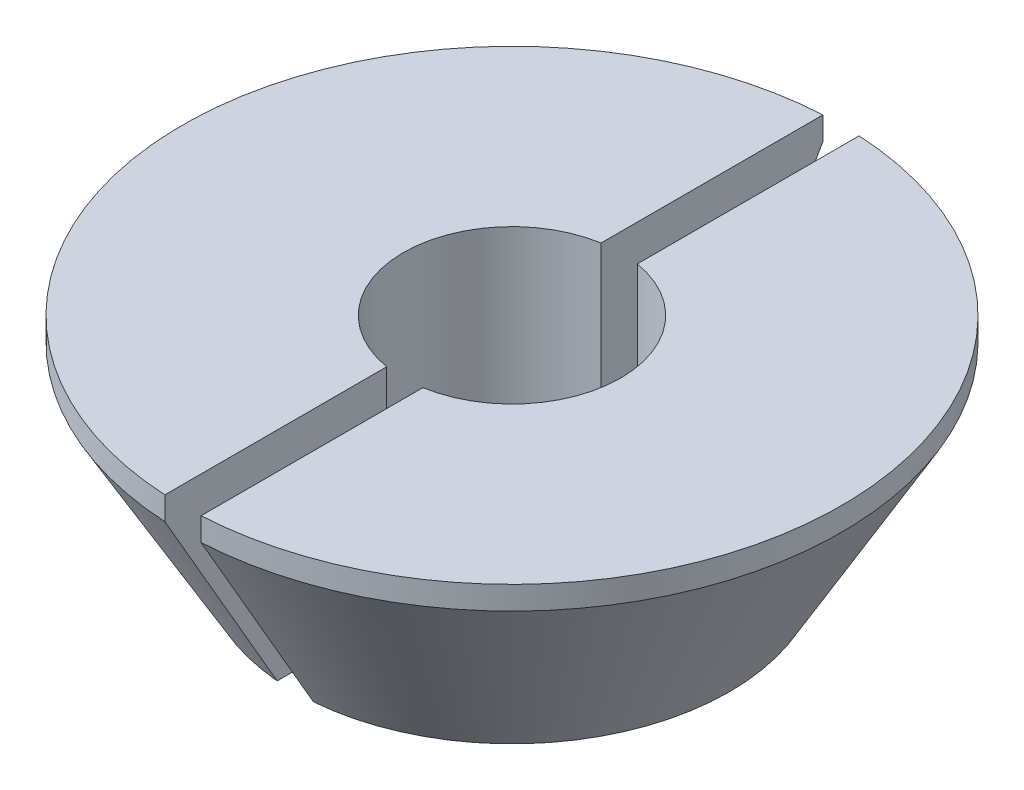
ISO-10303-21;
HEADER;
FILE_DESCRIPTION(('STEP AP214'),'2;1');
FILE_NAME('part.step','',(''),(''),'','','');
FILE_SCHEMA(('AUTOMOTIVE_DESIGN { 1 0 10303 214 1 1 1 1 }'));
ENDSEC;
DATA;
#1=APPLICATION_CONTEXT('core data for automotive mechanical design processes');
#2=APPLICATION_PROTOCOL_DEFINITION('international standard','automotive_design',2000,#1);
#3=PRODUCT_CONTEXT('',#1,'mechanical');
#4=PRODUCT('Part','Part','',(#3));
#5=PRODUCT_RELATED_PRODUCT_CATEGORY('part','',(#4));
#6=PRODUCT_DEFINITION_FORMATION('','',#4);
#7=PRODUCT_DEFINITION_CONTEXT('part definition',#1,'design');
#8=PRODUCT_DEFINITION('design','',#6,#7);
#9=PRODUCT_DEFINITION_SHAPE('','',#8);
#10=(LENGTH_UNIT() NAMED_UNIT(*) SI_UNIT(.MILLI.,.METRE.));
#11=(NAMED_UNIT(*) PLANE_ANGLE_UNIT() SI_UNIT($,.RADIAN.));
#12=(NAMED_UNIT(*) SI_UNIT($,.STERADIAN.) SOLID_ANGLE_UNIT());
#13=UNCERTAINTY_MEASURE_WITH_UNIT(LENGTH_MEASURE(1.E-05),#10,'distance_accuracy_value','');
#14=(GEOMETRIC_REPRESENTATION_CONTEXT(3) GLOBAL_UNCERTAINTY_ASSIGNED_CONTEXT((#13)) GLOBAL_UNIT_ASSIGNED_CONTEXT((#10,
#11,#12)) REPRESENTATION_CONTEXT('',''));
#15=CARTESIAN_POINT('',(0.,0.,0.));
#16=DIRECTION('',(0.,0.,1.));
#17=DIRECTION('',(1.,0.,0.));
#18=AXIS2_PLACEMENT_3D('',#15,#16,#17);
#19=CARTESIAN_POINT('',(0.,0.,0.));
#20=DIRECTION('',(0.,-1.,0.));
#21=DIRECTION('',(0.,0.,-1.));
#22=AXIS2_PLACEMENT_3D('',#19,#20,#21);
#23=CYLINDRICAL_SURFACE('',#22,1.5);
#24=DIRECTION('',(0.,-1.,0.));
#25=VECTOR('',#24,1.);
#26=CARTESIAN_POINT('',(0.25,0.,1.4790199457749));
#27=LINE('',#26,#25);
#28=CARTESIAN_POINT('',(0.25,3.,1.4790199457749));
#29=VERTEX_POINT('',#28);
#30=CARTESIAN_POINT('',(0.25,0.,1.4790199457749));
#31=VERTEX_POINT('',#30);
#32=EDGE_CURVE('E150',#29,#31,#27,.T.);
#33=ORIENTED_EDGE('',*,*,#32,.F.);
#34=CARTESIAN_POINT('',(0.,3.,0.));
#35=DIRECTION('',(0.,-1.,0.));
#36=DIRECTION('',(0.,0.,-1.));
#37=AXIS2_PLACEMENT_3D('',#34,#35,#36);
#38=CIRCLE('',#37,1.5);
#39=CARTESIAN_POINT('',(0.25,3.,-1.4790199457749));
#40=VERTEX_POINT('',#39);
#41=EDGE_CURVE('E52',#40,#29,#38,.T.);
#42=ORIENTED_EDGE('',*,*,#41,.F.);
#43=DIRECTION('',(0.,-1.,0.));
#44=VECTOR('',#43,1.);
#45=CARTESIAN_POINT('',(0.25,0.,-1.4790199457749));
#46=LINE('',#45,#44);
#47=CARTESIAN_POINT('',(0.25,0.,-1.4790199457749));
#48=VERTEX_POINT('',#47);
#49=EDGE_CURVE('E97',#48,#40,#46,.F.);
#50=ORIENTED_EDGE('',*,*,#49,.F.);
#51=CARTESIAN_POINT('',(0.,0.,0.));
#52=DIRECTION('',(0.,-1.,0.));
#53=DIRECTION('',(0.,0.,-1.));
#54=AXIS2_PLACEMENT_3D('',#51,#52,#53);
#55=CIRCLE('',#54,1.5);
#56=EDGE_CURVE('E117',#48,#31,#55,.T.);
#57=ORIENTED_EDGE('',*,*,#56,.T.);
#58=EDGE_LOOP('',(#33,#42,#50,#57));
#59=FACE_BOUND('',#58,.T.);
#60=ADVANCED_FACE('F49',(#59),#23,.F.);
#61=CARTESIAN_POINT('',(1.5,0.,0.));
#62=DIRECTION('',(0.,-1.,0.));
#63=DIRECTION('',(0.,0.,-1.));
#64=AXIS2_PLACEMENT_3D('',#61,#62,#63);
#65=PLANE('',#64);
#66=DIRECTION('',(0.,0.,1.));
#67=VECTOR('',#66,1.);
#68=CARTESIAN_POINT('',(0.25,0.,0.));
#69=LINE('',#68,#67);
#70=CARTESIAN_POINT('',(0.25,0.,-2.98956518577535));
#71=VERTEX_POINT('',#70);
#72=EDGE_CURVE('E127',#71,#48,#69,.T.);
#73=ORIENTED_EDGE('',*,*,#72,.F.);
#74=CARTESIAN_POINT('',(0.,0.,0.));
#75=DIRECTION('',(0.,-1.,0.));
#76=DIRECTION('',(0.,0.,-1.));
#77=AXIS2_PLACEMENT_3D('',#74,#75,#76);
#78=CIRCLE('',#77,3.);
#79=CARTESIAN_POINT('',(0.25,0.,2.98956518577535));
#80=VERTEX_POINT('',#79);
#81=EDGE_CURVE('E112',#71,#80,#78,.T.);
#82=ORIENTED_EDGE('',*,*,#81,.T.);
#83=EDGE_CURVE('E153',#31,#80,#69,.T.);
#84=ORIENTED_EDGE('',*,*,#83,.F.);
#85=ORIENTED_EDGE('',*,*,#56,.F.);
#86=EDGE_LOOP('',(#73,#82,#84,#85));
#87=FACE_BOUND('',#86,.T.);
#88=ADVANCED_FACE('F142',(#87),#65,.T.);
#89=CARTESIAN_POINT('',(0.,0.,0.));
#90=DIRECTION('',(0.,1.,0.));
#91=DIRECTION('',(0.,0.,1.));
#92=AXIS2_PLACEMENT_3D('',#89,#90,#91);
#93=CONICAL_SURFACE('',#92,3.,0.523598775598296);
#94=CARTESIAN_POINT('',(0.249999999999999,2.6807,-4.54082606615063));
#95=CARTESIAN_POINT('',(0.249999999999999,2.24282508484156,-4.28762076430231));
#96=CARTESIAN_POINT('',(0.249999999999999,1.8049651977419,-4.03438947359155));
#97=CARTESIAN_POINT('',(0.249999999999999,0.92933615344063,-3.52774845765405));
#98=CARTESIAN_POINT('',(0.249999999999999,0.49156699838448,-3.27433872871972));
#99=CARTESIAN_POINT('',(0.25,-0.38290424074479,-2.76774480529198));
#100=CARTESIAN_POINT('',(0.25,-0.8196066731844,-2.51456121274121));
#101=CARTESIAN_POINT('',(0.25,-1.47433863102313,-2.13424065627073));
#102=CARTESIAN_POINT('',(0.25,-1.69252711278028,-2.00737737771368));
#103=CARTESIAN_POINT('',(0.25,-2.12871865239022,-1.75333254800784));
#104=CARTESIAN_POINT('',(0.25,-2.34672171043193,-1.62615099718385));
#105=CARTESIAN_POINT('',(0.25,-2.67338925274294,-1.43493930887547));
#106=CARTESIAN_POINT('',(0.25,-2.78219253621661,-1.37114636659856));
#107=CARTESIAN_POINT('',(0.25,-2.99966103496985,-1.24331731030749));
#108=CARTESIAN_POINT('',(0.25,-3.1083262457018,-1.17928118854744));
#109=CARTESIAN_POINT('',(0.25,-3.32552104440077,-1.05077009745405));
#110=CARTESIAN_POINT('',(0.25,-3.43405043984082,-0.986294802670086));
#111=CARTESIAN_POINT('',(0.25,-3.65071032494582,-0.856696231223135));
#112=CARTESIAN_POINT('',(0.25,-3.75884084956416,-0.791573013280735));
#113=CARTESIAN_POINT('',(0.25,-3.92042077172299,-0.692898671881654));
#114=CARTESIAN_POINT('',(0.25,-3.9741733307267,-0.659845300436586));
#115=CARTESIAN_POINT('',(0.25,-4.08136868616102,-0.593212363226417));
#116=CARTESIAN_POINT('',(0.25,-4.13481140834315,-0.559632677941373));
#117=CARTESIAN_POINT('',(0.25,-4.24113339587235,-0.491669338691902));
#118=CARTESIAN_POINT('',(0.25,-4.29401305057322,-0.457286300981416));
#119=CARTESIAN_POINT('',(0.25,-4.37255770119354,-0.404574651873339));
#120=CARTESIAN_POINT('',(0.25,-4.39860551402581,-0.386817870865241));
#121=CARTESIAN_POINT('',(0.25,-4.45031555464801,-0.350753252021787));
#122=CARTESIAN_POINT('',(0.25,-4.47597783167177,-0.332445485460932));
#123=CARTESIAN_POINT('',(0.25,-4.52710548992428,-0.294700574823512));
#124=CARTESIAN_POINT('',(0.25,-4.55256090591925,-0.275249918341901));
#125=CARTESIAN_POINT('',(0.25,-4.6024080850432,-0.234978795187447));
#126=CARTESIAN_POINT('',(0.25,-4.62679984555317,-0.214158325142062));
#127=CARTESIAN_POINT('',(0.25,-4.66347748303172,-0.179389052667987));
#128=CARTESIAN_POINT('',(0.25,-4.67652515207045,-0.166252119990767));
#129=CARTESIAN_POINT('',(0.25,-4.70132212521057,-0.138774734168565));
#130=CARTESIAN_POINT('',(0.25,-4.71307275512415,-0.124435536850069));
#131=CARTESIAN_POINT('',(0.25,-4.72991061836599,-0.100144765308829));
#132=CARTESIAN_POINT('',(0.25,-4.73577860332474,-0.0907440327189435));
#133=CARTESIAN_POINT('',(0.25,-4.7461921133281,-0.0712315103966624));
#134=CARTESIAN_POINT('',(0.25,-4.75074032286035,-0.061121216743992));
#135=CARTESIAN_POINT('',(0.25,-4.75713928477966,-0.0425184679805892));
#136=CARTESIAN_POINT('',(0.25,-4.75936285540817,-0.0341574525230934));
#137=CARTESIAN_POINT('',(0.25,-4.76236342203798,-0.0171814430696285));
#138=CARTESIAN_POINT('',(0.25,-4.76314257081326,-0.0085668465122424));
#139=CARTESIAN_POINT('',(0.25,-4.76313684861099,0.00868165997329201));
#140=CARTESIAN_POINT('',(0.25,-4.76234839456552,0.0173155689869348));
#141=CARTESIAN_POINT('',(0.25,-4.75932421660707,0.0343257917263134));
#142=CARTESIAN_POINT('',(0.25,-4.7570865981595,0.0427017531925235));
#143=CARTESIAN_POINT('',(0.25,-4.75011179427286,0.0629030301838492));
#144=CARTESIAN_POINT('',(0.25,-4.7446930872633,0.0744877331806617));
#145=CARTESIAN_POINT('',(0.25,-4.73221351183934,0.0967372322393329));
#146=CARTESIAN_POINT('',(0.25,-4.72514660913672,0.107398445661035));
#147=CARTESIAN_POINT('',(0.25,-4.70580537909828,0.133628063440305));
#148=CARTESIAN_POINT('',(0.25,-4.69281069558329,0.148654531572276));
#149=CARTESIAN_POINT('',(0.25,-4.66551638469681,0.177489604297637));
#150=CARTESIAN_POINT('',(0.25,-4.65121327274687,0.191294752185098));
#151=CARTESIAN_POINT('',(0.25,-4.62174445658502,0.218151203360591));
#152=CARTESIAN_POINT('',(0.25,-4.60657357666941,0.23119678232939));
#153=CARTESIAN_POINT('',(0.25,-4.57576024519108,0.2566658647089));
#154=CARTESIAN_POINT('',(0.25,-4.56011848155362,0.269090211166063));
#155=CARTESIAN_POINT('',(0.25,-4.50675824978141,0.310322302015449));
#156=CARTESIAN_POINT('',(0.25,-4.46828324398197,0.338145168868119));
#157=CARTESIAN_POINT('',(0.25,-4.39046776564366,0.392559363878935));
#158=CARTESIAN_POINT('',(0.25,-4.35112689362169,0.419150105228246));
#159=CARTESIAN_POINT('',(0.25,-4.27188203606789,0.47161885923185));
#160=CARTESIAN_POINT('',(0.25,-4.23197725106012,0.49749566489473));
#161=CARTESIAN_POINT('',(0.25,-4.15186532131031,0.548754895623053));
#162=CARTESIAN_POINT('',(0.25,-4.11165824216505,0.574137423884496));
#163=CARTESIAN_POINT('',(0.25,-3.99106939338384,0.649581054014351));
#164=CARTESIAN_POINT('',(0.25,-3.91038394781262,0.699156113968719));
#165=CARTESIAN_POINT('',(0.25,-3.74866805993289,0.797581574452877));
#166=CARTESIAN_POINT('',(0.25,-3.66763796466265,0.846432549129256));
#167=CARTESIAN_POINT('',(0.25,-3.42459411913125,0.992139814049182));
#168=CARTESIAN_POINT('',(0.25,-3.26222232809275,1.08839839623966));
#169=CARTESIAN_POINT('',(0.25,-2.93707671432733,1.28023677122309));
#170=CARTESIAN_POINT('',(0.25,-2.77430288471991,1.37581655228898));
#171=CARTESIAN_POINT('',(0.25,-2.44847758445448,1.56663040459881));
#172=CARTESIAN_POINT('',(0.25,-2.28542603774138,1.66186434608288));
#173=CARTESIAN_POINT('',(0.25,-1.95919434476702,1.85210891580518));
#174=CARTESIAN_POINT('',(0.25,-1.79601419937054,1.94711954552828));
#175=CARTESIAN_POINT('',(0.25,-1.30606990294085,2.23210497691436));
#176=CARTESIAN_POINT('',(0.25,-0.979183185565835,2.42186905336453));
#177=CARTESIAN_POINT('',(0.25,-0.325288308534112,2.8011158864206));
#178=CARTESIAN_POINT('',(0.25,0.00171983660741655,2.99059866807669));
#179=CARTESIAN_POINT('',(0.25,0.524787330598917,3.29352326253736));
#180=CARTESIAN_POINT('',(0.25,0.720818266981803,3.40701413015443));
#181=CARTESIAN_POINT('',(0.25,1.11290895050228,3.63395786721474));
#182=CARTESIAN_POINT('',(0.25,1.3089686982575,3.74741073559076));
#183=CARTESIAN_POINT('',(0.25,1.70096835056404,3.97420584542751));
#184=CARTESIAN_POINT('',(0.25,1.89690824254633,4.08754810861328));
#185=CARTESIAN_POINT('',(0.25,2.28879702838803,4.31420525904073));
#186=CARTESIAN_POINT('',(0.25,2.48474592187851,4.42752014692027));
#187=CARTESIAN_POINT('',(0.25,2.6807,4.54082606615063));
#188=B_SPLINE_CURVE_WITH_KNOTS('',3,(#94,#95,#96,#97,#98,#99,#100,#101,#102,#103,#104,#105,#106,
#107,#108,#109,#110,#111,#112,#113,#114,#115,#116,#117,#118,#119,#120,#121,#122,#123,#124,#125,
#126,#127,#128,#129,#130,#131,#132,#133,#134,#135,#136,#137,#138,#139,#140,#141,#142,#143,#144,
#145,#146,#147,#148,#149,#150,#151,#152,#153,#154,#155,#156,#157,#158,#159,#160,#161,#162,#163,
#164,#165,#166,#167,#168,#169,#170,#171,#172,#173,#174,#175,#176,#177,#178,#179,#180,#181,#182,
#183,#184,#185,#186,#187),.UNSPECIFIED.,.F.,.F.,(4,2,2,2,2,2,2,2,2,2,2,2,2,2,2,2,2,2,2,2,2,2,2,
2,2,2,2,2,2,2,2,2,2,2,2,2,2,2,2,2,2,2,2,2,2,2,4),(0.,1.51744068446225,3.03491388795545,
4.549277514375,5.30644620705686,6.06361412734904,6.44199109166311,6.82038021107881,
7.19908946745284,7.5777647089145,7.76706853499709,7.95641599127198,8.14562268087666,
8.24019213503555,8.3347494080009,8.43084224874819,8.52693532608927,8.58244194026205,
8.63789128052992,8.67107023231365,8.70418121566975,8.73003093158457,8.75584208987611,
8.78171231252709,8.80761642452787,8.84576281926494,8.88405112892627,8.94348680469306,
9.00308565176152,9.06308722655265,9.12300503377629,9.26538479322802,9.40783167941314,
9.55050622228194,9.69315065086058,9.97723808566998,10.261086704165,10.8273607226971,
11.3936445005607,11.9601224263811,12.5265965748273,13.6605221063644,14.7943397419966,
15.4738798308851,16.1534376271018,16.8325180245826,17.5115806804844),.UNSPECIFIED.);
#189=CARTESIAN_POINT('',(0.249999999999999,2.68,-4.54042130885477));
#190=VERTEX_POINT('',#189);
#191=EDGE_CURVE('E109',#190,#71,#188,.T.);
#192=ORIENTED_EDGE('',*,*,#191,.F.);
#193=CARTESIAN_POINT('',(0.,2.68,0.));
#194=DIRECTION('',(0.,-1.,0.));
#195=DIRECTION('',(0.,0.,-1.));
#196=AXIS2_PLACEMENT_3D('',#193,#194,#195);
#197=CIRCLE('',#196,4.54729872142819);
#198=CARTESIAN_POINT('',(0.25,2.68,4.54042130885477));
#199=VERTEX_POINT('',#198);
#200=EDGE_CURVE('E108',#190,#199,#197,.T.);
#201=ORIENTED_EDGE('',*,*,#200,.T.);
#202=EDGE_CURVE('E128',#80,#199,#188,.T.);
#203=ORIENTED_EDGE('',*,*,#202,.F.);
#204=ORIENTED_EDGE('',*,*,#81,.F.);
#205=EDGE_LOOP('',(#192,#201,#203,#204));
#206=FACE_BOUND('',#205,.T.);
#207=ADVANCED_FACE('F130',(#206),#93,.T.);
#208=CARTESIAN_POINT('',(0.,0.,0.));
#209=DIRECTION('',(0.,-1.,0.));
#210=DIRECTION('',(0.,0.,-1.));
#211=AXIS2_PLACEMENT_3D('',#208,#209,#210);
#212=CYLINDRICAL_SURFACE('',#211,4.54729872142819);
#213=DIRECTION('',(0.,-1.,0.));
#214=VECTOR('',#213,1.);
#215=CARTESIAN_POINT('',(0.25,0.,4.54042130885477));
#216=LINE('',#215,#214);
#217=CARTESIAN_POINT('',(0.250000000000001,3.,4.54042130885477));
#218=VERTEX_POINT('',#217);
#219=EDGE_CURVE('E57',#199,#218,#216,.F.);
#220=ORIENTED_EDGE('',*,*,#219,.F.);
#221=ORIENTED_EDGE('',*,*,#200,.F.);
#222=DIRECTION('',(0.,-1.,0.));
#223=VECTOR('',#222,1.);
#224=CARTESIAN_POINT('',(0.249999999999999,0.,-4.54042130885477));
#225=LINE('',#224,#223);
#226=CARTESIAN_POINT('',(0.249999999999999,3.,-4.54042130885477));
#227=VERTEX_POINT('',#226);
#228=EDGE_CURVE('E94',#227,#190,#225,.T.);
#229=ORIENTED_EDGE('',*,*,#228,.F.);
#230=CARTESIAN_POINT('',(0.,3.,0.));
#231=DIRECTION('',(0.,-1.,0.));
#232=DIRECTION('',(0.,0.,-1.));
#233=AXIS2_PLACEMENT_3D('',#230,#231,#232);
#234=CIRCLE('',#233,4.54729872142819);
#235=EDGE_CURVE('E106',#227,#218,#234,.T.);
#236=ORIENTED_EDGE('',*,*,#235,.T.);
#237=EDGE_LOOP('',(#220,#221,#229,#236));
#238=FACE_BOUND('',#237,.T.);
#239=ADVANCED_FACE('F105',(#238),#212,.T.);
#240=CARTESIAN_POINT('',(4.54729872142819,3.,0.));
#241=DIRECTION('',(0.,1.,0.));
#242=DIRECTION('',(0.,0.,1.));
#243=AXIS2_PLACEMENT_3D('',#240,#241,#242);
#244=PLANE('',#243);
#245=DIRECTION('',(0.,0.,-1.));
#246=VECTOR('',#245,1.);
#247=CARTESIAN_POINT('',(0.25,3.,0.));
#248=LINE('',#247,#246);
#249=EDGE_CURVE('E12',#218,#29,#248,.T.);
#250=ORIENTED_EDGE('',*,*,#249,.F.);
#251=ORIENTED_EDGE('',*,*,#235,.F.);
#252=EDGE_CURVE('E59',#40,#227,#248,.T.);
#253=ORIENTED_EDGE('',*,*,#252,.F.);
#254=ORIENTED_EDGE('',*,*,#41,.T.);
#255=EDGE_LOOP('',(#250,#251,#253,#254));
#256=FACE_BOUND('',#255,.T.);
#257=ADVANCED_FACE('F111',(#256),#244,.T.);
#258=CARTESIAN_POINT('',(0.249999999999999,-7.,-5.));
#259=DIRECTION('',(1.,0.,0.));
#260=DIRECTION('',(0.,0.,-1.));
#261=AXIS2_PLACEMENT_3D('',#258,#259,#260);
#262=PLANE('',#261);
#263=ORIENTED_EDGE('',*,*,#49,.T.);
#264=ORIENTED_EDGE('',*,*,#252,.T.);
#265=ORIENTED_EDGE('',*,*,#228,.T.);
#266=ORIENTED_EDGE('',*,*,#191,.T.);
#267=ORIENTED_EDGE('',*,*,#72,.T.);
#268=EDGE_LOOP('',(#263,#264,#265,#266,#267));
#269=FACE_BOUND('',#268,.T.);
#270=ADVANCED_FACE('F93',(#269),#262,.F.);
#271=ORIENTED_EDGE('',*,*,#32,.T.);
#272=ORIENTED_EDGE('',*,*,#83,.T.);
#273=ORIENTED_EDGE('',*,*,#202,.T.);
#274=ORIENTED_EDGE('',*,*,#219,.T.);
#275=ORIENTED_EDGE('',*,*,#249,.T.);
#276=EDGE_LOOP('',(#271,#272,#273,#274,#275));
#277=FACE_BOUND('',#276,.T.);
#278=ADVANCED_FACE('F136',(#277),#262,.F.);
#279=CLOSED_SHELL('',(#60,#88,#207,#239,#257,#270,#278));
#280=MANIFOLD_SOLID_BREP('B2',#279);
#281=CARTESIAN_POINT('',(4.54729872142819,3.,0.));
#282=DIRECTION('',(0.,1.,0.));
#283=DIRECTION('',(0.,0.,1.));
#284=AXIS2_PLACEMENT_3D('',#281,#282,#283);
#285=PLANE('',#284);
#286=DIRECTION('',(0.,0.,1.));
#287=VECTOR('',#286,1.);
#288=CARTESIAN_POINT('',(-0.25,3.,0.));
#289=LINE('',#288,#287);
#290=CARTESIAN_POINT('',(-0.250000000000001,3.,-4.54042130885477));
#291=VERTEX_POINT('',#290);
#292=CARTESIAN_POINT('',(-0.25,3.,-1.4790199457749));
#293=VERTEX_POINT('',#292);
#294=EDGE_CURVE('E47',#291,#293,#289,.T.);
#295=ORIENTED_EDGE('',*,*,#294,.F.);
#296=CARTESIAN_POINT('',(0.,3.,0.));
#297=DIRECTION('',(0.,-1.,0.));
#298=DIRECTION('',(0.,0.,-1.));
#299=AXIS2_PLACEMENT_3D('',#296,#297,#298);
#300=CIRCLE('',#299,4.54729872142819);
#301=CARTESIAN_POINT('',(-0.25,3.,4.54042130885477));
#302=VERTEX_POINT('',#301);
#303=EDGE_CURVE('E263',#302,#291,#300,.T.);
#304=ORIENTED_EDGE('',*,*,#303,.F.);
#305=CARTESIAN_POINT('',(-0.25,3.,1.4790199457749));
#306=VERTEX_POINT('',#305);
#307=EDGE_CURVE('E205',#306,#302,#289,.T.);
#308=ORIENTED_EDGE('',*,*,#307,.F.);
#309=CARTESIAN_POINT('',(0.,3.,0.));
#310=DIRECTION('',(0.,-1.,0.));
#311=DIRECTION('',(0.,0.,-1.));
#312=AXIS2_PLACEMENT_3D('',#309,#310,#311);
#313=CIRCLE('',#312,1.5);
#314=EDGE_CURVE('E256',#306,#293,#313,.T.);
#315=ORIENTED_EDGE('',*,*,#314,.T.);
#316=EDGE_LOOP('',(#295,#304,#308,#315));
#317=FACE_BOUND('',#316,.T.);
#318=ADVANCED_FACE('F201',(#317),#285,.T.);
#319=CARTESIAN_POINT('',(0.,0.,0.));
#320=DIRECTION('',(0.,-1.,0.));
#321=DIRECTION('',(0.,0.,-1.));
#322=AXIS2_PLACEMENT_3D('',#319,#320,#321);
#323=CYLINDRICAL_SURFACE('',#322,4.54729872142819);
#324=DIRECTION('',(0.,-1.,0.));
#325=VECTOR('',#324,1.);
#326=CARTESIAN_POINT('',(-0.250000000000001,0.,-4.54042130885477));
#327=LINE('',#326,#325);
#328=CARTESIAN_POINT('',(-0.250000000000001,2.68,-4.54042130885477));
#329=VERTEX_POINT('',#328);
#330=EDGE_CURVE('E216',#329,#291,#327,.F.);
#331=ORIENTED_EDGE('',*,*,#330,.F.);
#332=CARTESIAN_POINT('',(0.,2.68,0.));
#333=DIRECTION('',(0.,-1.,0.));
#334=DIRECTION('',(0.,0.,-1.));
#335=AXIS2_PLACEMENT_3D('',#332,#333,#334);
#336=CIRCLE('',#335,4.54729872142819);
#337=CARTESIAN_POINT('',(-0.25,2.68,4.54042130885477));
#338=VERTEX_POINT('',#337);
#339=EDGE_CURVE('E266',#338,#329,#336,.T.);
#340=ORIENTED_EDGE('',*,*,#339,.F.);
#341=DIRECTION('',(0.,-1.,0.));
#342=VECTOR('',#341,1.);
#343=CARTESIAN_POINT('',(-0.25,0.,4.54042130885477));
#344=LINE('',#343,#342);
#345=EDGE_CURVE('E280',#302,#338,#344,.T.);
#346=ORIENTED_EDGE('',*,*,#345,.F.);
#347=ORIENTED_EDGE('',*,*,#303,.T.);
#348=EDGE_LOOP('',(#331,#340,#346,#347));
#349=FACE_BOUND('',#348,.T.);
#350=ADVANCED_FACE('F284',(#349),#323,.T.);
#351=CARTESIAN_POINT('',(0.,0.,0.));
#352=DIRECTION('',(0.,1.,0.));
#353=DIRECTION('',(0.,0.,1.));
#354=AXIS2_PLACEMENT_3D('',#351,#352,#353);
#355=CONICAL_SURFACE('',#354,3.,0.523598775598296);
#356=CARTESIAN_POINT('',(-0.25,2.6807,4.54082606615063));
#357=CARTESIAN_POINT('',(-0.25,2.24282508484156,4.28762076430231));
#358=CARTESIAN_POINT('',(-0.25,1.8049651977419,4.03438947359155));
#359=CARTESIAN_POINT('',(-0.25,0.929336153440633,3.52774845765405));
#360=CARTESIAN_POINT('',(-0.25,0.491566998384483,3.27433872871972));
#361=CARTESIAN_POINT('',(-0.25,-0.382904240744788,2.76774480529198));
#362=CARTESIAN_POINT('',(-0.25,-0.819606673184398,2.51456121274121));
#363=CARTESIAN_POINT('',(-0.25,-1.47433863102313,2.13424065627073));
#364=CARTESIAN_POINT('',(-0.25,-1.69252711278028,2.00737737771368));
#365=CARTESIAN_POINT('',(-0.25,-2.12871865239022,1.75333254800784));
#366=CARTESIAN_POINT('',(-0.25,-2.34672171043193,1.62615099718385));
#367=CARTESIAN_POINT('',(-0.25,-2.67338925274294,1.43493930887547));
#368=CARTESIAN_POINT('',(-0.25,-2.78219253621661,1.37114636659856));
#369=CARTESIAN_POINT('',(-0.25,-2.99966103496985,1.24331731030749));
#370=CARTESIAN_POINT('',(-0.25,-3.1083262457018,1.17928118854744));
#371=CARTESIAN_POINT('',(-0.25,-3.32552104440077,1.05077009745405));
#372=CARTESIAN_POINT('',(-0.25,-3.43405043984082,0.986294802670086));
#373=CARTESIAN_POINT('',(-0.25,-3.65071032494582,0.856696231223135));
#374=CARTESIAN_POINT('',(-0.25,-3.75884084956416,0.791573013280735));
#375=CARTESIAN_POINT('',(-0.25,-3.92042077172299,0.692898671881655));
#376=CARTESIAN_POINT('',(-0.25,-3.9741733307267,0.659845300436586));
#377=CARTESIAN_POINT('',(-0.25,-4.08136868616102,0.593212363226417));
#378=CARTESIAN_POINT('',(-0.25,-4.13481140834315,0.559632677941373));
#379=CARTESIAN_POINT('',(-0.25,-4.24113339587235,0.491669338691903));
#380=CARTESIAN_POINT('',(-0.25,-4.29401305057322,0.457286300981416));
#381=CARTESIAN_POINT('',(-0.25,-4.37255770119354,0.40457465187334));
#382=CARTESIAN_POINT('',(-0.25,-4.39860551402581,0.386817870865242));
#383=CARTESIAN_POINT('',(-0.25,-4.45031555464801,0.350753252021788));
#384=CARTESIAN_POINT('',(-0.25,-4.47597783167177,0.332445485460932));
#385=CARTESIAN_POINT('',(-0.25,-4.52710548992428,0.294700574823512));
#386=CARTESIAN_POINT('',(-0.25,-4.55256090591925,0.275249918341901));
#387=CARTESIAN_POINT('',(-0.25,-4.6024080850432,0.234978795187447));
#388=CARTESIAN_POINT('',(-0.25,-4.62679984555317,0.214158325142061));
#389=CARTESIAN_POINT('',(-0.25,-4.66347748303172,0.179389052667986));
#390=CARTESIAN_POINT('',(-0.25,-4.67652515207045,0.166252119990767));
#391=CARTESIAN_POINT('',(-0.25,-4.70132212521057,0.138774734168565));
#392=CARTESIAN_POINT('',(-0.25,-4.71307275512415,0.124435536850068));
#393=CARTESIAN_POINT('',(-0.25,-4.72991061836599,0.100144765308829));
#394=CARTESIAN_POINT('',(-0.25,-4.73577860332474,0.0907440327189437));
#395=CARTESIAN_POINT('',(-0.25,-4.7461921133281,0.0712315103966622));
#396=CARTESIAN_POINT('',(-0.25,-4.75074032286035,0.0611212167439916));
#397=CARTESIAN_POINT('',(-0.25,-4.75713928477966,0.0425184679805892));
#398=CARTESIAN_POINT('',(-0.25,-4.75936285540817,0.034157452523094));
#399=CARTESIAN_POINT('',(-0.25,-4.76236342203797,0.0171814430696291));
#400=CARTESIAN_POINT('',(-0.25,-4.76314257081326,0.00856684651224235));
#401=CARTESIAN_POINT('',(-0.25,-4.76313684861099,-0.00868165997329267));
#402=CARTESIAN_POINT('',(-0.25,-4.76234839456552,-0.0173155689869353));
#403=CARTESIAN_POINT('',(-0.25,-4.75932421660707,-0.0343257917263141));
#404=CARTESIAN_POINT('',(-0.25,-4.7570865981595,-0.0427017531925242));
#405=CARTESIAN_POINT('',(-0.25,-4.75011179427285,-0.0629030301838505));
#406=CARTESIAN_POINT('',(-0.25,-4.74469308726329,-0.0744877331806634));
#407=CARTESIAN_POINT('',(-0.25,-4.73221351183933,-0.0967372322393345));
#408=CARTESIAN_POINT('',(-0.25,-4.72514660913672,-0.107398445661036));
#409=CARTESIAN_POINT('',(-0.25,-4.70580537909828,-0.133628063440306));
#410=CARTESIAN_POINT('',(-0.25,-4.69281069558329,-0.148654531572278));
#411=CARTESIAN_POINT('',(-0.25,-4.6655163846968,-0.177489604297638));
#412=CARTESIAN_POINT('',(-0.25,-4.65121327274687,-0.191294752185099));
#413=CARTESIAN_POINT('',(-0.25,-4.62174445658501,-0.218151203360593));
#414=CARTESIAN_POINT('',(-0.25,-4.60657357666941,-0.231196782329392));
#415=CARTESIAN_POINT('',(-0.25,-4.57576024519108,-0.256665864708903));
#416=CARTESIAN_POINT('',(-0.25,-4.56011848155361,-0.269090211166066));
#417=CARTESIAN_POINT('',(-0.25,-4.5067582497814,-0.310322302015451));
#418=CARTESIAN_POINT('',(-0.25,-4.46828324398196,-0.338145168868123));
#419=CARTESIAN_POINT('',(-0.25,-4.39046776564365,-0.392559363878939));
#420=CARTESIAN_POINT('',(-0.25,-4.35112689362169,-0.419150105228251));
#421=CARTESIAN_POINT('',(-0.25,-4.27188203606788,-0.471618859231856));
#422=CARTESIAN_POINT('',(-0.25,-4.23197725106012,-0.497495664894735));
#423=CARTESIAN_POINT('',(-0.25,-4.1518653213103,-0.548754895623059));
#424=CARTESIAN_POINT('',(-0.25,-4.11165824216504,-0.574137423884502));
#425=CARTESIAN_POINT('',(-0.25,-3.99106939338383,-0.649581054014358));
#426=CARTESIAN_POINT('',(-0.25,-3.91038394781261,-0.699156113968727));
#427=CARTESIAN_POINT('',(-0.25,-3.74866805993287,-0.797581574452887));
#428=CARTESIAN_POINT('',(-0.25,-3.66763796466263,-0.846432549129267));
#429=CARTESIAN_POINT('',(-0.25,-3.42459411913122,-0.992139814049195));
#430=CARTESIAN_POINT('',(-0.25,-3.26222232809272,-1.08839839623968));
#431=CARTESIAN_POINT('',(-0.25,-2.9370767143273,-1.2802367712231));
#432=CARTESIAN_POINT('',(-0.25,-2.77430288471988,-1.375816552289));
#433=CARTESIAN_POINT('',(-0.25,-2.44847758445444,-1.56663040459883));
#434=CARTESIAN_POINT('',(-0.25,-2.28542603774134,-1.6618643460829));
#435=CARTESIAN_POINT('',(-0.25,-1.95919434476698,-1.85210891580521));
#436=CARTESIAN_POINT('',(-0.25,-1.79601419937049,-1.94711954552831));
#437=CARTESIAN_POINT('',(-0.25,-1.30606990294079,-2.2321049769144));
#438=CARTESIAN_POINT('',(-0.25,-0.979183185565771,-2.42186905336456));
#439=CARTESIAN_POINT('',(-0.25,-0.325288308534036,-2.80111588642065));
#440=CARTESIAN_POINT('',(-0.250000000000001,0.00171983660749738,-2.99059866807674));
#441=CARTESIAN_POINT('',(-0.250000000000001,0.524787330598996,-3.2935232625374));
#442=CARTESIAN_POINT('',(-0.250000000000001,0.720818266981874,-3.40701413015447));
#443=CARTESIAN_POINT('',(-0.250000000000001,1.11290895050233,-3.63395786721477));
#444=CARTESIAN_POINT('',(-0.250000000000001,1.30896869825755,-3.74741073559079));
#445=CARTESIAN_POINT('',(-0.250000000000001,1.70096835056407,-3.97420584542753));
#446=CARTESIAN_POINT('',(-0.250000000000001,1.89690824254636,-4.08754810861329));
#447=CARTESIAN_POINT('',(-0.250000000000001,2.28879702838804,-4.31420525904073));
#448=CARTESIAN_POINT('',(-0.250000000000001,2.48474592187851,-4.42752014692027));
#449=CARTESIAN_POINT('',(-0.250000000000001,2.6807,-4.54082606615063));
#450=B_SPLINE_CURVE_WITH_KNOTS('',3,(#356,#357,#358,#359,#360,#361,#362,#363,#364,#365,#366,
#367,#368,#369,#370,#371,#372,#373,#374,#375,#376,#377,#378,#379,#380,#381,#382,#383,#384,#385,
#386,#387,#388,#389,#390,#391,#392,#393,#394,#395,#396,#397,#398,#399,#400,#401,#402,#403,#404,
#405,#406,#407,#408,#409,#410,#411,#412,#413,#414,#415,#416,#417,#418,#419,#420,#421,#422,#423,
#424,#425,#426,#427,#428,#429,#430,#431,#432,#433,#434,#435,#436,#437,#438,#439,#440,#441,#442,
#443,#444,#445,#446,#447,#448,#449),.UNSPECIFIED.,.F.,.F.,(4,2,2,2,2,2,2,2,2,2,2,2,2,2,2,2,2,2,
2,2,2,2,2,2,2,2,2,2,2,2,2,2,2,2,2,2,2,2,2,2,2,2,2,2,2,2,4),(0.,1.51744068446225,
3.03491388795544,4.54927751437499,5.30644620705686,6.06361412734904,6.44199109166311,
6.82038021107881,7.19908946745284,7.5777647089145,7.76706853499709,7.95641599127198,
8.14562268087666,8.24019213503555,8.3347494080009,8.4308422487482,8.52693532608928,
8.58244194026205,8.63789128052992,8.67107023231365,8.70418121566975,8.73003093158457,
8.75584208987611,8.78171231252709,8.80761642452787,8.84576281926494,8.88405112892627,
8.94348680469307,9.00308565176152,9.06308722655265,9.1230050337763,9.26538479322803,
9.40783167941315,9.55050622228195,9.69315065086059,9.97723808567,10.2610867041651,
10.8273607226971,11.3936445005608,11.9601224263811,12.5265965748274,13.6605221063645,
14.7943397419967,15.4738798308852,16.1534376271018,16.8325180245826,17.5115806804844),.UNSPECIFIED.);
#451=CARTESIAN_POINT('',(-0.25,0.,2.98956518577535));
#452=VERTEX_POINT('',#451);
#453=EDGE_CURVE('E286',#338,#452,#450,.T.);
#454=ORIENTED_EDGE('',*,*,#453,.F.);
#455=ORIENTED_EDGE('',*,*,#339,.T.);
#456=CARTESIAN_POINT('',(-0.250000000000001,0.,-2.98956518577535));
#457=VERTEX_POINT('',#456);
#458=EDGE_CURVE('E291',#457,#329,#450,.T.);
#459=ORIENTED_EDGE('',*,*,#458,.F.);
#460=CARTESIAN_POINT('',(0.,0.,0.));
#461=DIRECTION('',(0.,-1.,0.));
#462=DIRECTION('',(0.,0.,-1.));
#463=AXIS2_PLACEMENT_3D('',#460,#461,#462);
#464=CIRCLE('',#463,3.);
#465=EDGE_CURVE('E273',#452,#457,#464,.T.);
#466=ORIENTED_EDGE('',*,*,#465,.F.);
#467=EDGE_LOOP('',(#454,#455,#459,#466));
#468=FACE_BOUND('',#467,.T.);
#469=ADVANCED_FACE('F300',(#468),#355,.T.);
#470=CARTESIAN_POINT('',(1.5,0.,0.));
#471=DIRECTION('',(0.,-1.,0.));
#472=DIRECTION('',(0.,0.,-1.));
#473=AXIS2_PLACEMENT_3D('',#470,#471,#472);
#474=PLANE('',#473);
#475=DIRECTION('',(0.,0.,-1.));
#476=VECTOR('',#475,1.);
#477=CARTESIAN_POINT('',(-0.25,0.,0.));
#478=LINE('',#477,#476);
#479=CARTESIAN_POINT('',(-0.25,0.,1.4790199457749));
#480=VERTEX_POINT('',#479);
#481=EDGE_CURVE('E289',#452,#480,#478,.T.);
#482=ORIENTED_EDGE('',*,*,#481,.F.);
#483=ORIENTED_EDGE('',*,*,#465,.T.);
#484=CARTESIAN_POINT('',(-0.25,0.,-1.4790199457749));
#485=VERTEX_POINT('',#484);
#486=EDGE_CURVE('E260',#485,#457,#478,.T.);
#487=ORIENTED_EDGE('',*,*,#486,.F.);
#488=CARTESIAN_POINT('',(0.,0.,0.));
#489=DIRECTION('',(0.,-1.,0.));
#490=DIRECTION('',(0.,0.,-1.));
#491=AXIS2_PLACEMENT_3D('',#488,#489,#490);
#492=CIRCLE('',#491,1.5);
#493=EDGE_CURVE('E258',#480,#485,#492,.T.);
#494=ORIENTED_EDGE('',*,*,#493,.F.);
#495=EDGE_LOOP('',(#482,#483,#487,#494));
#496=FACE_BOUND('',#495,.T.);
#497=ADVANCED_FACE('F311',(#496),#474,.T.);
#498=CARTESIAN_POINT('',(0.,0.,0.));
#499=DIRECTION('',(0.,-1.,0.));
#500=DIRECTION('',(0.,0.,-1.));
#501=AXIS2_PLACEMENT_3D('',#498,#499,#500);
#502=CYLINDRICAL_SURFACE('',#501,1.5);
#503=DIRECTION('',(0.,-1.,0.));
#504=VECTOR('',#503,1.);
#505=CARTESIAN_POINT('',(-0.25,0.,-1.4790199457749));
#506=LINE('',#505,#504);
#507=EDGE_CURVE('E247',#293,#485,#506,.T.);
#508=ORIENTED_EDGE('',*,*,#507,.F.);
#509=ORIENTED_EDGE('',*,*,#314,.F.);
#510=DIRECTION('',(0.,-1.,0.));
#511=VECTOR('',#510,1.);
#512=CARTESIAN_POINT('',(-0.25,0.,1.4790199457749));
#513=LINE('',#512,#511);
#514=EDGE_CURVE('E224',#480,#306,#513,.F.);
#515=ORIENTED_EDGE('',*,*,#514,.F.);
#516=ORIENTED_EDGE('',*,*,#493,.T.);
#517=EDGE_LOOP('',(#508,#509,#515,#516));
#518=FACE_BOUND('',#517,.T.);
#519=ADVANCED_FACE('F203',(#518),#502,.F.);
#520=CARTESIAN_POINT('',(-0.250000000000001,-7.,-5.));
#521=DIRECTION('',(-1.,0.,0.));
#522=DIRECTION('',(0.,0.,1.));
#523=AXIS2_PLACEMENT_3D('',#520,#521,#522);
#524=PLANE('',#523);
#525=ORIENTED_EDGE('',*,*,#514,.T.);
#526=ORIENTED_EDGE('',*,*,#307,.T.);
#527=ORIENTED_EDGE('',*,*,#345,.T.);
#528=ORIENTED_EDGE('',*,*,#453,.T.);
#529=ORIENTED_EDGE('',*,*,#481,.T.);
#530=EDGE_LOOP('',(#525,#526,#527,#528,#529));
#531=FACE_BOUND('',#530,.T.);
#532=ADVANCED_FACE('F279',(#531),#524,.F.);
#533=ORIENTED_EDGE('',*,*,#507,.T.);
#534=ORIENTED_EDGE('',*,*,#486,.T.);
#535=ORIENTED_EDGE('',*,*,#458,.T.);
#536=ORIENTED_EDGE('',*,*,#330,.T.);
#537=ORIENTED_EDGE('',*,*,#294,.T.);
#538=EDGE_LOOP('',(#533,#534,#535,#536,#537));
#539=FACE_BOUND('',#538,.T.);
#540=ADVANCED_FACE('F246',(#539),#524,.F.);
#541=CLOSED_SHELL('',(#318,#350,#469,#497,#519,#532,#540));
#542=MANIFOLD_SOLID_BREP('B6',#541);
#543=ADVANCED_BREP_SHAPE_REPRESENTATION('',(#18,#280,#542),#14);
#544=SHAPE_DEFINITION_REPRESENTATION(#9,#543);
ENDSEC;
END-ISO-10303-21;
